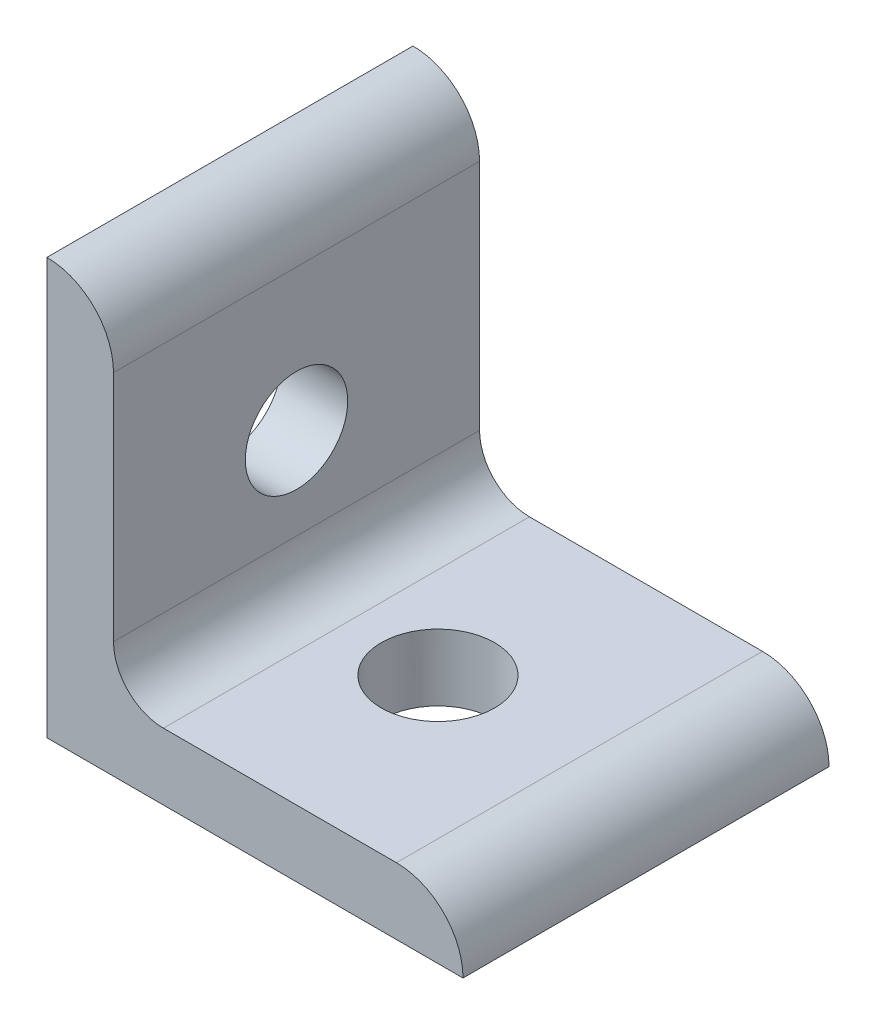
ISO-10303-21;
HEADER;
FILE_DESCRIPTION(('STEP AP214'),'2;1');
FILE_NAME('part.step','',(''),(''),'','','');
FILE_SCHEMA(('AUTOMOTIVE_DESIGN { 1 0 10303 214 1 1 1 1 }'));
ENDSEC;
DATA;
#1=APPLICATION_CONTEXT('core data for automotive mechanical design processes');
#2=APPLICATION_PROTOCOL_DEFINITION('international standard','automotive_design',2000,#1);
#3=PRODUCT_CONTEXT('',#1,'mechanical');
#4=PRODUCT('Part','Part','',(#3));
#5=PRODUCT_RELATED_PRODUCT_CATEGORY('part','',(#4));
#6=PRODUCT_DEFINITION_FORMATION('','',#4);
#7=PRODUCT_DEFINITION_CONTEXT('part definition',#1,'design');
#8=PRODUCT_DEFINITION('design','',#6,#7);
#9=PRODUCT_DEFINITION_SHAPE('','',#8);
#10=(LENGTH_UNIT() NAMED_UNIT(*) SI_UNIT(.MILLI.,.METRE.));
#11=(NAMED_UNIT(*) PLANE_ANGLE_UNIT() SI_UNIT($,.RADIAN.));
#12=(NAMED_UNIT(*) SI_UNIT($,.STERADIAN.) SOLID_ANGLE_UNIT());
#13=UNCERTAINTY_MEASURE_WITH_UNIT(LENGTH_MEASURE(1.E-05),#10,'distance_accuracy_value','');
#14=(GEOMETRIC_REPRESENTATION_CONTEXT(3) GLOBAL_UNCERTAINTY_ASSIGNED_CONTEXT((#13)) GLOBAL_UNIT_ASSIGNED_CONTEXT((#10,
#11,#12)) REPRESENTATION_CONTEXT('',''));
#15=CARTESIAN_POINT('',(0.,0.,0.));
#16=DIRECTION('',(0.,0.,1.));
#17=DIRECTION('',(1.,0.,0.));
#18=AXIS2_PLACEMENT_3D('',#15,#16,#17);
#19=CARTESIAN_POINT('',(25.,0.,10.9982));
#20=DIRECTION('',(0.,1.,0.));
#21=DIRECTION('',(-1.,0.,0.));
#22=AXIS2_PLACEMENT_3D('',#19,#20,#21);
#23=PLANE('',#22);
#24=CARTESIAN_POINT('',(12.4968,0.,0.));
#25=DIRECTION('',(0.,-1.,0.));
#26=DIRECTION('',(1.,0.,0.));
#27=AXIS2_PLACEMENT_3D('',#24,#25,#26);
#28=CIRCLE('',#27,3.4036);
#29=CARTESIAN_POINT('',(15.9004,0.,0.));
#30=VERTEX_POINT('',#29);
#31=EDGE_CURVE('E165',#30,#30,#28,.T.);
#32=ORIENTED_EDGE('',*,*,#31,.F.);
#33=EDGE_LOOP('',(#32));
#34=FACE_BOUND('',#33,.T.);
#35=DIRECTION('',(1.,0.,0.));
#36=VECTOR('',#35,1.);
#37=CARTESIAN_POINT('',(25.,0.,-10.9982));
#38=LINE('',#37,#36);
#39=CARTESIAN_POINT('',(0.,0.,-10.9982));
#40=VERTEX_POINT('',#39);
#41=CARTESIAN_POINT('',(25.,0.,-10.9982));
#42=VERTEX_POINT('',#41);
#43=EDGE_CURVE('E114',#40,#42,#38,.T.);
#44=ORIENTED_EDGE('',*,*,#43,.T.);
#45=DIRECTION('',(0.,0.,-1.));
#46=VECTOR('',#45,1.);
#47=CARTESIAN_POINT('',(25.,0.,10.9982));
#48=LINE('',#47,#46);
#49=CARTESIAN_POINT('',(25.,0.,10.9982));
#50=VERTEX_POINT('',#49);
#51=EDGE_CURVE('E112',#50,#42,#48,.T.);
#52=ORIENTED_EDGE('',*,*,#51,.F.);
#53=DIRECTION('',(1.,0.,0.));
#54=VECTOR('',#53,1.);
#55=CARTESIAN_POINT('',(25.,0.,10.9982));
#56=LINE('',#55,#54);
#57=CARTESIAN_POINT('',(0.,0.,10.9982));
#58=VERTEX_POINT('',#57);
#59=EDGE_CURVE('E97',#58,#50,#56,.T.);
#60=ORIENTED_EDGE('',*,*,#59,.F.);
#61=DIRECTION('',(0.,0.,-1.));
#62=VECTOR('',#61,1.);
#63=CARTESIAN_POINT('',(0.,0.,10.9982));
#64=LINE('',#63,#62);
#65=EDGE_CURVE('E153',#58,#40,#64,.T.);
#66=ORIENTED_EDGE('',*,*,#65,.T.);
#67=EDGE_LOOP('',(#44,#52,#60,#66));
#68=FACE_BOUND('',#67,.T.);
#69=ADVANCED_FACE('F39',(#34,#68),#23,.F.);
#70=CARTESIAN_POINT('',(4.,4.,10.9982));
#71=DIRECTION('',(0.,-1.,0.));
#72=DIRECTION('',(0.,0.,-1.));
#73=AXIS2_PLACEMENT_3D('',#70,#71,#72);
#74=PLANE('',#73);
#75=CARTESIAN_POINT('',(12.4968,4.,0.));
#76=DIRECTION('',(0.,-1.,0.));
#77=DIRECTION('',(0.,0.,-1.));
#78=AXIS2_PLACEMENT_3D('',#75,#76,#77);
#79=CIRCLE('',#78,3.4036);
#80=CARTESIAN_POINT('',(12.4968,4.,-3.4036));
#81=VERTEX_POINT('',#80);
#82=EDGE_CURVE('E163',#81,#81,#79,.F.);
#83=ORIENTED_EDGE('',*,*,#82,.F.);
#84=EDGE_LOOP('',(#83));
#85=FACE_BOUND('',#84,.T.);
#86=DIRECTION('',(-1.,0.,0.));
#87=VECTOR('',#86,1.);
#88=CARTESIAN_POINT('',(4.,4.,-10.9982));
#89=LINE('',#88,#87);
#90=CARTESIAN_POINT('',(21.,4.,-10.9982));
#91=VERTEX_POINT('',#90);
#92=CARTESIAN_POINT('',(7.,4.,-10.9982));
#93=VERTEX_POINT('',#92);
#94=EDGE_CURVE('E147',#91,#93,#89,.T.);
#95=ORIENTED_EDGE('',*,*,#94,.T.);
#96=DIRECTION('',(0.,0.,-1.));
#97=VECTOR('',#96,1.);
#98=CARTESIAN_POINT('',(7.,4.,10.9982));
#99=LINE('',#98,#97);
#100=CARTESIAN_POINT('',(7.,4.,10.9982));
#101=VERTEX_POINT('',#100);
#102=EDGE_CURVE('E60',#93,#101,#99,.F.);
#103=ORIENTED_EDGE('',*,*,#102,.T.);
#104=DIRECTION('',(-1.,0.,0.));
#105=VECTOR('',#104,1.);
#106=CARTESIAN_POINT('',(4.,4.,10.9982));
#107=LINE('',#106,#105);
#108=CARTESIAN_POINT('',(21.,4.,10.9982));
#109=VERTEX_POINT('',#108);
#110=EDGE_CURVE('E107',#109,#101,#107,.T.);
#111=ORIENTED_EDGE('',*,*,#110,.F.);
#112=DIRECTION('',(0.,0.,-1.));
#113=VECTOR('',#112,1.);
#114=CARTESIAN_POINT('',(21.,4.,10.9982));
#115=LINE('',#114,#113);
#116=EDGE_CURVE('E116',#109,#91,#115,.T.);
#117=ORIENTED_EDGE('',*,*,#116,.T.);
#118=EDGE_LOOP('',(#95,#103,#111,#117));
#119=FACE_BOUND('',#118,.T.);
#120=ADVANCED_FACE('F158',(#85,#119),#74,.F.);
#121=CARTESIAN_POINT('',(4.,25.,10.9982));
#122=DIRECTION('',(-1.,0.,0.));
#123=DIRECTION('',(0.,-1.,0.));
#124=AXIS2_PLACEMENT_3D('',#121,#122,#123);
#125=PLANE('',#124);
#126=CARTESIAN_POINT('',(4.,12.4968,0.));
#127=DIRECTION('',(-1.,0.,0.));
#128=DIRECTION('',(0.,-1.,0.));
#129=AXIS2_PLACEMENT_3D('',#126,#127,#128);
#130=CIRCLE('',#129,3.07595313543744);
#131=CARTESIAN_POINT('',(4.,9.42084686456256,0.));
#132=VERTEX_POINT('',#131);
#133=EDGE_CURVE('E169',#132,#132,#130,.F.);
#134=ORIENTED_EDGE('',*,*,#133,.F.);
#135=EDGE_LOOP('',(#134));
#136=FACE_BOUND('',#135,.T.);
#137=DIRECTION('',(0.,1.,0.));
#138=VECTOR('',#137,1.);
#139=CARTESIAN_POINT('',(4.,25.,10.9982));
#140=LINE('',#139,#138);
#141=CARTESIAN_POINT('',(4.,7.,10.9982));
#142=VERTEX_POINT('',#141);
#143=CARTESIAN_POINT('',(4.,21.,10.9982));
#144=VERTEX_POINT('',#143);
#145=EDGE_CURVE('E140',#142,#144,#140,.T.);
#146=ORIENTED_EDGE('',*,*,#145,.F.);
#147=DIRECTION('',(0.,0.,-1.));
#148=VECTOR('',#147,1.);
#149=CARTESIAN_POINT('',(4.,7.,-10.9982));
#150=LINE('',#149,#148);
#151=CARTESIAN_POINT('',(4.,7.,-10.9982));
#152=VERTEX_POINT('',#151);
#153=EDGE_CURVE('E126',#142,#152,#150,.T.);
#154=ORIENTED_EDGE('',*,*,#153,.T.);
#155=DIRECTION('',(0.,1.,0.));
#156=VECTOR('',#155,1.);
#157=CARTESIAN_POINT('',(4.,25.,-10.9982));
#158=LINE('',#157,#156);
#159=CARTESIAN_POINT('',(4.,21.,-10.9982));
#160=VERTEX_POINT('',#159);
#161=EDGE_CURVE('E138',#152,#160,#158,.T.);
#162=ORIENTED_EDGE('',*,*,#161,.T.);
#163=DIRECTION('',(0.,0.,-1.));
#164=VECTOR('',#163,1.);
#165=CARTESIAN_POINT('',(4.,21.,10.9982));
#166=LINE('',#165,#164);
#167=EDGE_CURVE('E122',#160,#144,#166,.F.);
#168=ORIENTED_EDGE('',*,*,#167,.T.);
#169=EDGE_LOOP('',(#146,#154,#162,#168));
#170=FACE_BOUND('',#169,.T.);
#171=ADVANCED_FACE('F137',(#136,#170),#125,.F.);
#172=CARTESIAN_POINT('',(0.,0.,10.9982));
#173=DIRECTION('',(1.,0.,0.));
#174=DIRECTION('',(0.,0.,-1.));
#175=AXIS2_PLACEMENT_3D('',#172,#173,#174);
#176=PLANE('',#175);
#177=CARTESIAN_POINT('',(0.,12.4968,0.));
#178=DIRECTION('',(-1.,0.,0.));
#179=DIRECTION('',(0.,0.,1.));
#180=AXIS2_PLACEMENT_3D('',#177,#178,#179);
#181=CIRCLE('',#180,3.07595313543744);
#182=CARTESIAN_POINT('',(0.,12.4968,3.07595313543744));
#183=VERTEX_POINT('',#182);
#184=EDGE_CURVE('E174',#183,#183,#181,.T.);
#185=ORIENTED_EDGE('',*,*,#184,.F.);
#186=EDGE_LOOP('',(#185));
#187=FACE_BOUND('',#186,.T.);
#188=DIRECTION('',(0.,-1.,0.));
#189=VECTOR('',#188,1.);
#190=CARTESIAN_POINT('',(0.,0.,-10.9982));
#191=LINE('',#190,#189);
#192=CARTESIAN_POINT('',(0.,25.,-10.9982));
#193=VERTEX_POINT('',#192);
#194=EDGE_CURVE('E108',#193,#40,#191,.T.);
#195=ORIENTED_EDGE('',*,*,#194,.T.);
#196=ORIENTED_EDGE('',*,*,#65,.F.);
#197=DIRECTION('',(0.,-1.,0.));
#198=VECTOR('',#197,1.);
#199=CARTESIAN_POINT('',(0.,0.,10.9982));
#200=LINE('',#199,#198);
#201=CARTESIAN_POINT('',(0.,25.,10.9982));
#202=VERTEX_POINT('',#201);
#203=EDGE_CURVE('E103',#202,#58,#200,.T.);
#204=ORIENTED_EDGE('',*,*,#203,.F.);
#205=DIRECTION('',(0.,0.,-1.));
#206=VECTOR('',#205,1.);
#207=CARTESIAN_POINT('',(0.,25.,10.9982));
#208=LINE('',#207,#206);
#209=EDGE_CURVE('E117',#202,#193,#208,.T.);
#210=ORIENTED_EDGE('',*,*,#209,.T.);
#211=EDGE_LOOP('',(#195,#196,#204,#210));
#212=FACE_BOUND('',#211,.T.);
#213=ADVANCED_FACE('F181',(#187,#212),#176,.F.);
#214=CARTESIAN_POINT('',(0.,0.,10.9982));
#215=DIRECTION('',(0.,0.,-1.));
#216=DIRECTION('',(-1.,0.,0.));
#217=AXIS2_PLACEMENT_3D('',#214,#215,#216);
#218=PLANE('',#217);
#219=ORIENTED_EDGE('',*,*,#59,.T.);
#220=CARTESIAN_POINT('',(21.,0.,10.9982));
#221=DIRECTION('',(0.,0.,-1.));
#222=DIRECTION('',(-1.,0.,0.));
#223=AXIS2_PLACEMENT_3D('',#220,#221,#222);
#224=CIRCLE('',#223,4.);
#225=EDGE_CURVE('E101',#50,#109,#224,.F.);
#226=ORIENTED_EDGE('',*,*,#225,.T.);
#227=ORIENTED_EDGE('',*,*,#110,.T.);
#228=CARTESIAN_POINT('',(7.,7.,10.9982));
#229=DIRECTION('',(0.,0.,-1.));
#230=DIRECTION('',(-1.,0.,0.));
#231=AXIS2_PLACEMENT_3D('',#228,#229,#230);
#232=CIRCLE('',#231,3.);
#233=EDGE_CURVE('E11',#101,#142,#232,.T.);
#234=ORIENTED_EDGE('',*,*,#233,.T.);
#235=ORIENTED_EDGE('',*,*,#145,.T.);
#236=CARTESIAN_POINT('',(0.,21.,10.9982));
#237=DIRECTION('',(0.,0.,-1.));
#238=DIRECTION('',(-1.,0.,0.));
#239=AXIS2_PLACEMENT_3D('',#236,#237,#238);
#240=CIRCLE('',#239,4.);
#241=EDGE_CURVE('E123',#144,#202,#240,.F.);
#242=ORIENTED_EDGE('',*,*,#241,.T.);
#243=ORIENTED_EDGE('',*,*,#203,.T.);
#244=EDGE_LOOP('',(#219,#226,#227,#234,#235,#242,#243));
#245=FACE_BOUND('',#244,.T.);
#246=ADVANCED_FACE('F99',(#245),#218,.F.);
#247=CARTESIAN_POINT('',(0.,0.,-10.9982));
#248=DIRECTION('',(0.,0.,-1.));
#249=DIRECTION('',(-1.,0.,0.));
#250=AXIS2_PLACEMENT_3D('',#247,#248,#249);
#251=PLANE('',#250);
#252=ORIENTED_EDGE('',*,*,#94,.F.);
#253=CARTESIAN_POINT('',(21.,0.,-10.9982));
#254=DIRECTION('',(0.,0.,-1.));
#255=DIRECTION('',(-1.,0.,0.));
#256=AXIS2_PLACEMENT_3D('',#253,#254,#255);
#257=CIRCLE('',#256,4.);
#258=EDGE_CURVE('E128',#91,#42,#257,.T.);
#259=ORIENTED_EDGE('',*,*,#258,.T.);
#260=ORIENTED_EDGE('',*,*,#43,.F.);
#261=ORIENTED_EDGE('',*,*,#194,.F.);
#262=CARTESIAN_POINT('',(0.,21.,-10.9982));
#263=DIRECTION('',(0.,0.,-1.));
#264=DIRECTION('',(-1.,0.,0.));
#265=AXIS2_PLACEMENT_3D('',#262,#263,#264);
#266=CIRCLE('',#265,4.);
#267=EDGE_CURVE('E145',#193,#160,#266,.T.);
#268=ORIENTED_EDGE('',*,*,#267,.T.);
#269=ORIENTED_EDGE('',*,*,#161,.F.);
#270=CARTESIAN_POINT('',(7.,7.,-10.9982));
#271=DIRECTION('',(0.,0.,-1.));
#272=DIRECTION('',(-1.,0.,0.));
#273=AXIS2_PLACEMENT_3D('',#270,#271,#272);
#274=CIRCLE('',#273,3.);
#275=EDGE_CURVE('E47',#152,#93,#274,.F.);
#276=ORIENTED_EDGE('',*,*,#275,.T.);
#277=EDGE_LOOP('',(#252,#259,#260,#261,#268,#269,#276));
#278=FACE_BOUND('',#277,.T.);
#279=ADVANCED_FACE('F143',(#278),#251,.T.);
#280=CARTESIAN_POINT('',(21.,0.,10.9982));
#281=DIRECTION('',(0.,0.,-1.));
#282=DIRECTION('',(-1.,0.,0.));
#283=AXIS2_PLACEMENT_3D('',#280,#281,#282);
#284=CYLINDRICAL_SURFACE('',#283,4.);
#285=ORIENTED_EDGE('',*,*,#225,.F.);
#286=ORIENTED_EDGE('',*,*,#51,.T.);
#287=ORIENTED_EDGE('',*,*,#258,.F.);
#288=ORIENTED_EDGE('',*,*,#116,.F.);
#289=EDGE_LOOP('',(#285,#286,#287,#288));
#290=FACE_BOUND('',#289,.T.);
#291=ADVANCED_FACE('F120',(#290),#284,.T.);
#292=CARTESIAN_POINT('',(0.,21.,10.9982));
#293=DIRECTION('',(0.,0.,-1.));
#294=DIRECTION('',(-1.,0.,0.));
#295=AXIS2_PLACEMENT_3D('',#292,#293,#294);
#296=CYLINDRICAL_SURFACE('',#295,4.);
#297=ORIENTED_EDGE('',*,*,#241,.F.);
#298=ORIENTED_EDGE('',*,*,#167,.F.);
#299=ORIENTED_EDGE('',*,*,#267,.F.);
#300=ORIENTED_EDGE('',*,*,#209,.F.);
#301=EDGE_LOOP('',(#297,#298,#299,#300));
#302=FACE_BOUND('',#301,.T.);
#303=ADVANCED_FACE('F188',(#302),#296,.T.);
#304=CARTESIAN_POINT('',(7.,7.,10.9982));
#305=DIRECTION('',(0.,0.,1.));
#306=DIRECTION('',(1.,0.,0.));
#307=AXIS2_PLACEMENT_3D('',#304,#305,#306);
#308=CYLINDRICAL_SURFACE('',#307,3.);
#309=ORIENTED_EDGE('',*,*,#233,.F.);
#310=ORIENTED_EDGE('',*,*,#102,.F.);
#311=ORIENTED_EDGE('',*,*,#275,.F.);
#312=ORIENTED_EDGE('',*,*,#153,.F.);
#313=EDGE_LOOP('',(#309,#310,#311,#312));
#314=FACE_BOUND('',#313,.T.);
#315=ADVANCED_FACE('F41',(#314),#308,.F.);
#316=CARTESIAN_POINT('',(12.4968,25.001,0.));
#317=DIRECTION('',(0.,-1.,0.));
#318=DIRECTION('',(1.,0.,0.));
#319=AXIS2_PLACEMENT_3D('',#316,#317,#318);
#320=CYLINDRICAL_SURFACE('',#319,3.4036);
#321=ORIENTED_EDGE('',*,*,#31,.T.);
#322=EDGE_LOOP('',(#321));
#323=FACE_BOUND('',#322,.T.);
#324=ORIENTED_EDGE('',*,*,#82,.T.);
#325=EDGE_LOOP('',(#324));
#326=FACE_BOUND('',#325,.T.);
#327=ADVANCED_FACE('F190',(#323,#326),#320,.F.);
#328=CARTESIAN_POINT('',(25.001,12.4968,0.));
#329=DIRECTION('',(-1.,0.,0.));
#330=DIRECTION('',(0.,0.,1.));
#331=AXIS2_PLACEMENT_3D('',#328,#329,#330);
#332=CYLINDRICAL_SURFACE('',#331,3.07595313543744);
#333=ORIENTED_EDGE('',*,*,#184,.T.);
#334=EDGE_LOOP('',(#333));
#335=FACE_BOUND('',#334,.T.);
#336=ORIENTED_EDGE('',*,*,#133,.T.);
#337=EDGE_LOOP('',(#336));
#338=FACE_BOUND('',#337,.T.);
#339=ADVANCED_FACE('F178',(#335,#338),#332,.F.);
#340=CLOSED_SHELL('',(#69,#120,#171,#213,#246,#279,#291,#303,#315,#327,#339));
#341=MANIFOLD_SOLID_BREP('B2',#340);
#342=ADVANCED_BREP_SHAPE_REPRESENTATION('',(#18,#341),#14);
#343=SHAPE_DEFINITION_REPRESENTATION(#9,#342);
ENDSEC;
END-ISO-10303-21;
